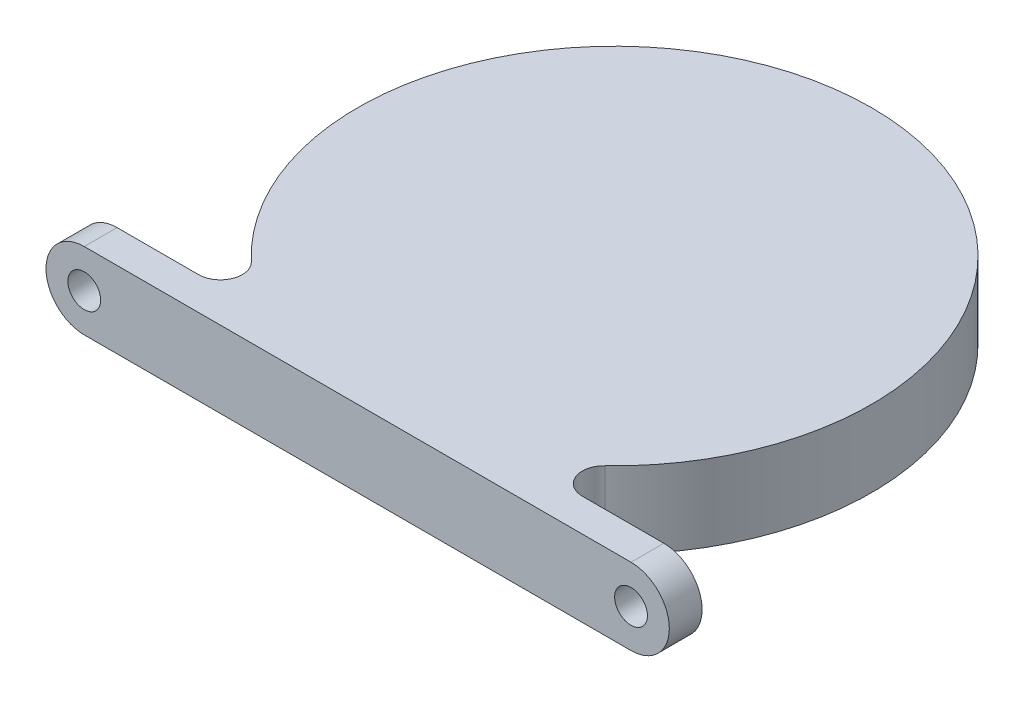
ISO-10303-21;
HEADER;
FILE_DESCRIPTION(('STEP AP214'),'2;1');
FILE_NAME('part.step','',(''),(''),'','','');
FILE_SCHEMA(('AUTOMOTIVE_DESIGN { 1 0 10303 214 1 1 1 1 }'));
ENDSEC;
DATA;
#1=APPLICATION_CONTEXT('core data for automotive mechanical design processes');
#2=APPLICATION_PROTOCOL_DEFINITION('international standard','automotive_design',2000,#1);
#3=PRODUCT_CONTEXT('',#1,'mechanical');
#4=PRODUCT('Part','Part','',(#3));
#5=PRODUCT_RELATED_PRODUCT_CATEGORY('part','',(#4));
#6=PRODUCT_DEFINITION_FORMATION('','',#4);
#7=PRODUCT_DEFINITION_CONTEXT('part definition',#1,'design');
#8=PRODUCT_DEFINITION('design','',#6,#7);
#9=PRODUCT_DEFINITION_SHAPE('','',#8);
#10=(LENGTH_UNIT() NAMED_UNIT(*) SI_UNIT(.MILLI.,.METRE.));
#11=(NAMED_UNIT(*) PLANE_ANGLE_UNIT() SI_UNIT($,.RADIAN.));
#12=(NAMED_UNIT(*) SI_UNIT($,.STERADIAN.) SOLID_ANGLE_UNIT());
#13=UNCERTAINTY_MEASURE_WITH_UNIT(LENGTH_MEASURE(1.E-05),#10,'distance_accuracy_value','');
#14=(GEOMETRIC_REPRESENTATION_CONTEXT(3) GLOBAL_UNCERTAINTY_ASSIGNED_CONTEXT((#13)) GLOBAL_UNIT_ASSIGNED_CONTEXT((#10,
#11,#12)) REPRESENTATION_CONTEXT('',''));
#15=CARTESIAN_POINT('',(0.,0.,0.));
#16=DIRECTION('',(0.,0.,1.));
#17=DIRECTION('',(1.,0.,0.));
#18=AXIS2_PLACEMENT_3D('',#15,#16,#17);
#19=CARTESIAN_POINT('',(0.,7.,0.));
#20=DIRECTION('',(0.,-1.,0.));
#21=DIRECTION('',(0.,0.,-1.));
#22=AXIS2_PLACEMENT_3D('',#19,#20,#21);
#23=CYLINDRICAL_SURFACE('',#22,23.5);
#24=CARTESIAN_POINT('',(0.,7.,0.));
#25=DIRECTION('',(0.,1.,0.));
#26=DIRECTION('',(0.,0.,1.));
#27=AXIS2_PLACEMENT_3D('',#24,#25,#26);
#28=CIRCLE('',#27,23.5);
#29=CARTESIAN_POINT('',(16.1734637728404,7.,17.0490196078431));
#30=VERTEX_POINT('',#29);
#31=CARTESIAN_POINT('',(-16.1734637728404,7.,17.0490196078431));
#32=VERTEX_POINT('',#31);
#33=EDGE_CURVE('E170',#30,#32,#28,.T.);
#34=ORIENTED_EDGE('',*,*,#33,.F.);
#35=DIRECTION('',(0.,-1.,0.));
#36=VECTOR('',#35,1.);
#37=CARTESIAN_POINT('',(16.1734637728404,7.,17.0490196078431));
#38=LINE('',#37,#36);
#39=CARTESIAN_POINT('',(16.1734637728404,0.,17.0490196078431));
#40=VERTEX_POINT('',#39);
#41=EDGE_CURVE('E181',#30,#40,#38,.T.);
#42=ORIENTED_EDGE('',*,*,#41,.T.);
#43=CARTESIAN_POINT('',(0.,0.,0.));
#44=DIRECTION('',(0.,1.,0.));
#45=DIRECTION('',(0.,0.,1.));
#46=AXIS2_PLACEMENT_3D('',#43,#44,#45);
#47=CIRCLE('',#46,23.5);
#48=CARTESIAN_POINT('',(-16.1734637728404,0.,17.0490196078431));
#49=VERTEX_POINT('',#48);
#50=EDGE_CURVE('E164',#40,#49,#47,.T.);
#51=ORIENTED_EDGE('',*,*,#50,.T.);
#52=DIRECTION('',(0.,-1.,0.));
#53=VECTOR('',#52,1.);
#54=CARTESIAN_POINT('',(-16.1734637728404,7.,17.0490196078431));
#55=LINE('',#54,#53);
#56=EDGE_CURVE('E178',#49,#32,#55,.F.);
#57=ORIENTED_EDGE('',*,*,#56,.T.);
#58=EDGE_LOOP('',(#34,#42,#51,#57));
#59=FACE_BOUND('',#58,.T.);
#60=ADVANCED_FACE('F41',(#59),#23,.T.);
#61=CARTESIAN_POINT('',(0.,7.,0.));
#62=DIRECTION('',(0.,1.,0.));
#63=DIRECTION('',(0.,0.,1.));
#64=AXIS2_PLACEMENT_3D('',#61,#62,#63);
#65=PLANE('',#64);
#66=DIRECTION('',(-1.,0.,0.));
#67=VECTOR('',#66,1.);
#68=CARTESIAN_POINT('',(-25.,7.,20.5));
#69=LINE('',#68,#67);
#70=CARTESIAN_POINT('',(25.,7.00000000000001,20.5));
#71=VERTEX_POINT('',#70);
#72=CARTESIAN_POINT('',(17.5499287747842,7.,20.5));
#73=VERTEX_POINT('',#72);
#74=EDGE_CURVE('E108',#71,#73,#69,.T.);
#75=ORIENTED_EDGE('',*,*,#74,.T.);
#76=CARTESIAN_POINT('',(17.5499287747842,7.,18.5));
#77=DIRECTION('',(0.,1.,0.));
#78=DIRECTION('',(0.,0.,1.));
#79=AXIS2_PLACEMENT_3D('',#76,#77,#78);
#80=CIRCLE('',#79,2.);
#81=EDGE_CURVE('E187',#73,#30,#80,.F.);
#82=ORIENTED_EDGE('',*,*,#81,.T.);
#83=ORIENTED_EDGE('',*,*,#33,.T.);
#84=CARTESIAN_POINT('',(-17.5499287747842,7.,18.5));
#85=DIRECTION('',(0.,1.,0.));
#86=DIRECTION('',(0.,0.,1.));
#87=AXIS2_PLACEMENT_3D('',#84,#85,#86);
#88=CIRCLE('',#87,2.);
#89=CARTESIAN_POINT('',(-17.5499287747842,7.,20.5));
#90=VERTEX_POINT('',#89);
#91=EDGE_CURVE('E11',#32,#90,#88,.F.);
#92=ORIENTED_EDGE('',*,*,#91,.T.);
#93=CARTESIAN_POINT('',(-25.,7.,20.5));
#94=VERTEX_POINT('',#93);
#95=EDGE_CURVE('E129',#90,#94,#69,.T.);
#96=ORIENTED_EDGE('',*,*,#95,.T.);
#97=DIRECTION('',(0.,0.,1.));
#98=VECTOR('',#97,1.);
#99=CARTESIAN_POINT('',(-25.,7.,20.5));
#100=LINE('',#99,#98);
#101=CARTESIAN_POINT('',(-25.,7.,23.5));
#102=VERTEX_POINT('',#101);
#103=EDGE_CURVE('E116',#94,#102,#100,.T.);
#104=ORIENTED_EDGE('',*,*,#103,.T.);
#105=DIRECTION('',(-1.,0.,0.));
#106=VECTOR('',#105,1.);
#107=CARTESIAN_POINT('',(-25.,7.,23.5));
#108=LINE('',#107,#106);
#109=CARTESIAN_POINT('',(25.,7.00000000000001,23.5));
#110=VERTEX_POINT('',#109);
#111=EDGE_CURVE('E110',#110,#102,#108,.T.);
#112=ORIENTED_EDGE('',*,*,#111,.F.);
#113=DIRECTION('',(0.,0.,1.));
#114=VECTOR('',#113,1.);
#115=CARTESIAN_POINT('',(25.,7.00000000000001,20.5));
#116=LINE('',#115,#114);
#117=EDGE_CURVE('E105',#71,#110,#116,.T.);
#118=ORIENTED_EDGE('',*,*,#117,.F.);
#119=EDGE_LOOP('',(#75,#82,#83,#92,#96,#104,#112,#118));
#120=FACE_BOUND('',#119,.T.);
#121=ADVANCED_FACE('F107',(#120),#65,.T.);
#122=CARTESIAN_POINT('',(0.,0.,0.));
#123=DIRECTION('',(0.,1.,0.));
#124=DIRECTION('',(0.,0.,1.));
#125=AXIS2_PLACEMENT_3D('',#122,#123,#124);
#126=PLANE('',#125);
#127=ORIENTED_EDGE('',*,*,#50,.F.);
#128=CARTESIAN_POINT('',(17.5499287747842,0.,18.5));
#129=DIRECTION('',(0.,1.,0.));
#130=DIRECTION('',(0.,0.,1.));
#131=AXIS2_PLACEMENT_3D('',#128,#129,#130);
#132=CIRCLE('',#131,2.);
#133=CARTESIAN_POINT('',(17.5499287747842,0.,20.5));
#134=VERTEX_POINT('',#133);
#135=EDGE_CURVE('E190',#40,#134,#132,.T.);
#136=ORIENTED_EDGE('',*,*,#135,.T.);
#137=DIRECTION('',(1.,0.,0.));
#138=VECTOR('',#137,1.);
#139=CARTESIAN_POINT('',(-25.,0.,20.5));
#140=LINE('',#139,#138);
#141=CARTESIAN_POINT('',(25.,0.,20.5));
#142=VERTEX_POINT('',#141);
#143=EDGE_CURVE('E149',#134,#142,#140,.T.);
#144=ORIENTED_EDGE('',*,*,#143,.T.);
#145=DIRECTION('',(0.,0.,1.));
#146=VECTOR('',#145,1.);
#147=CARTESIAN_POINT('',(25.,0.,20.5));
#148=LINE('',#147,#146);
#149=CARTESIAN_POINT('',(25.,0.,23.5));
#150=VERTEX_POINT('',#149);
#151=EDGE_CURVE('E134',#142,#150,#148,.T.);
#152=ORIENTED_EDGE('',*,*,#151,.T.);
#153=DIRECTION('',(1.,0.,0.));
#154=VECTOR('',#153,1.);
#155=CARTESIAN_POINT('',(-25.,0.,23.5));
#156=LINE('',#155,#154);
#157=CARTESIAN_POINT('',(-25.,0.,23.5));
#158=VERTEX_POINT('',#157);
#159=EDGE_CURVE('E136',#158,#150,#156,.T.);
#160=ORIENTED_EDGE('',*,*,#159,.F.);
#161=DIRECTION('',(0.,0.,1.));
#162=VECTOR('',#161,1.);
#163=CARTESIAN_POINT('',(-25.,0.,20.5));
#164=LINE('',#163,#162);
#165=CARTESIAN_POINT('',(-25.,0.,20.5));
#166=VERTEX_POINT('',#165);
#167=EDGE_CURVE('E165',#166,#158,#164,.T.);
#168=ORIENTED_EDGE('',*,*,#167,.F.);
#169=CARTESIAN_POINT('',(-17.5499287747842,0.,20.5));
#170=VERTEX_POINT('',#169);
#171=EDGE_CURVE('E117',#166,#170,#140,.T.);
#172=ORIENTED_EDGE('',*,*,#171,.T.);
#173=CARTESIAN_POINT('',(-17.5499287747842,0.,18.5));
#174=DIRECTION('',(0.,1.,0.));
#175=DIRECTION('',(0.,0.,1.));
#176=AXIS2_PLACEMENT_3D('',#173,#174,#175);
#177=CIRCLE('',#176,2.);
#178=EDGE_CURVE('E50',#170,#49,#177,.T.);
#179=ORIENTED_EDGE('',*,*,#178,.T.);
#180=EDGE_LOOP('',(#127,#136,#144,#152,#160,#168,#172,#179));
#181=FACE_BOUND('',#180,.T.);
#182=ADVANCED_FACE('F195',(#181),#126,.F.);
#183=CARTESIAN_POINT('',(25.,3.50000000000001,20.5));
#184=DIRECTION('',(0.,0.,1.));
#185=DIRECTION('',(1.,0.,0.));
#186=AXIS2_PLACEMENT_3D('',#183,#184,#185);
#187=PLANE('',#186);
#188=CARTESIAN_POINT('',(-25.,3.5,20.5));
#189=DIRECTION('',(0.,0.,1.));
#190=DIRECTION('',(1.,0.,0.));
#191=AXIS2_PLACEMENT_3D('',#188,#189,#190);
#192=CIRCLE('',#191,1.5);
#193=CARTESIAN_POINT('',(-23.5,3.5,20.5));
#194=VERTEX_POINT('',#193);
#195=EDGE_CURVE('E156',#194,#194,#192,.T.);
#196=ORIENTED_EDGE('',*,*,#195,.T.);
#197=EDGE_LOOP('',(#196));
#198=FACE_BOUND('',#197,.T.);
#199=ORIENTED_EDGE('',*,*,#95,.F.);
#200=DIRECTION('',(0.,1.,0.));
#201=VECTOR('',#200,1.);
#202=CARTESIAN_POINT('',(-17.5499287747842,0.,20.5));
#203=LINE('',#202,#201);
#204=EDGE_CURVE('E184',#90,#170,#203,.F.);
#205=ORIENTED_EDGE('',*,*,#204,.T.);
#206=ORIENTED_EDGE('',*,*,#171,.F.);
#207=CARTESIAN_POINT('',(-25.,3.5,20.5));
#208=DIRECTION('',(0.,0.,1.));
#209=DIRECTION('',(1.,0.,0.));
#210=AXIS2_PLACEMENT_3D('',#207,#208,#209);
#211=CIRCLE('',#210,3.5);
#212=EDGE_CURVE('E128',#94,#166,#211,.T.);
#213=ORIENTED_EDGE('',*,*,#212,.F.);
#214=EDGE_LOOP('',(#199,#205,#206,#213));
#215=FACE_BOUND('',#214,.T.);
#216=ADVANCED_FACE('F202',(#198,#215),#187,.F.);
#217=CARTESIAN_POINT('',(25.,3.50000000000001,20.5));
#218=DIRECTION('',(0.,0.,1.));
#219=DIRECTION('',(1.,0.,0.));
#220=AXIS2_PLACEMENT_3D('',#217,#218,#219);
#221=CIRCLE('',#220,1.5);
#222=CARTESIAN_POINT('',(26.5,3.50000000000001,20.5));
#223=VERTEX_POINT('',#222);
#224=EDGE_CURVE('E253',#223,#223,#221,.T.);
#225=ORIENTED_EDGE('',*,*,#224,.T.);
#226=EDGE_LOOP('',(#225));
#227=FACE_BOUND('',#226,.T.);
#228=ORIENTED_EDGE('',*,*,#143,.F.);
#229=DIRECTION('',(0.,1.,0.));
#230=VECTOR('',#229,1.);
#231=CARTESIAN_POINT('',(17.5499287747842,7.,20.5));
#232=LINE('',#231,#230);
#233=EDGE_CURVE('E126',#134,#73,#232,.T.);
#234=ORIENTED_EDGE('',*,*,#233,.T.);
#235=ORIENTED_EDGE('',*,*,#74,.F.);
#236=CARTESIAN_POINT('',(25.,3.50000000000001,20.5));
#237=DIRECTION('',(0.,0.,1.));
#238=DIRECTION('',(1.,0.,0.));
#239=AXIS2_PLACEMENT_3D('',#236,#237,#238);
#240=CIRCLE('',#239,3.5);
#241=EDGE_CURVE('E124',#142,#71,#240,.T.);
#242=ORIENTED_EDGE('',*,*,#241,.F.);
#243=EDGE_LOOP('',(#228,#234,#235,#242));
#244=FACE_BOUND('',#243,.T.);
#245=ADVANCED_FACE('F123',(#227,#244),#187,.F.);
#246=CARTESIAN_POINT('',(25.,3.50000000000001,23.5));
#247=DIRECTION('',(0.,0.,1.));
#248=DIRECTION('',(1.,0.,0.));
#249=AXIS2_PLACEMENT_3D('',#246,#247,#248);
#250=PLANE('',#249);
#251=CARTESIAN_POINT('',(-25.,3.5,23.5));
#252=DIRECTION('',(0.,0.,1.));
#253=DIRECTION('',(1.,0.,0.));
#254=AXIS2_PLACEMENT_3D('',#251,#252,#253);
#255=CIRCLE('',#254,1.5);
#256=CARTESIAN_POINT('',(-23.5,3.5,23.5));
#257=VERTEX_POINT('',#256);
#258=EDGE_CURVE('E143',#257,#257,#255,.T.);
#259=ORIENTED_EDGE('',*,*,#258,.F.);
#260=EDGE_LOOP('',(#259));
#261=FACE_BOUND('',#260,.T.);
#262=ORIENTED_EDGE('',*,*,#159,.T.);
#263=CARTESIAN_POINT('',(25.,3.50000000000001,23.5));
#264=DIRECTION('',(0.,0.,1.));
#265=DIRECTION('',(1.,0.,0.));
#266=AXIS2_PLACEMENT_3D('',#263,#264,#265);
#267=CIRCLE('',#266,3.5);
#268=EDGE_CURVE('E153',#150,#110,#267,.T.);
#269=ORIENTED_EDGE('',*,*,#268,.T.);
#270=ORIENTED_EDGE('',*,*,#111,.T.);
#271=CARTESIAN_POINT('',(-25.,3.5,23.5));
#272=DIRECTION('',(0.,0.,1.));
#273=DIRECTION('',(1.,0.,0.));
#274=AXIS2_PLACEMENT_3D('',#271,#272,#273);
#275=CIRCLE('',#274,3.5);
#276=EDGE_CURVE('E140',#102,#158,#275,.T.);
#277=ORIENTED_EDGE('',*,*,#276,.T.);
#278=EDGE_LOOP('',(#262,#269,#270,#277));
#279=FACE_BOUND('',#278,.T.);
#280=CARTESIAN_POINT('',(25.,3.50000000000001,23.5));
#281=DIRECTION('',(0.,0.,1.));
#282=DIRECTION('',(1.,0.,0.));
#283=AXIS2_PLACEMENT_3D('',#280,#281,#282);
#284=CIRCLE('',#283,1.5);
#285=CARTESIAN_POINT('',(26.5,3.50000000000001,23.5));
#286=VERTEX_POINT('',#285);
#287=EDGE_CURVE('E257',#286,#286,#284,.T.);
#288=ORIENTED_EDGE('',*,*,#287,.F.);
#289=EDGE_LOOP('',(#288));
#290=FACE_BOUND('',#289,.T.);
#291=ADVANCED_FACE('F210',(#261,#279,#290),#250,.T.);
#292=CARTESIAN_POINT('',(25.,3.50000000000001,20.5));
#293=DIRECTION('',(0.,0.,1.));
#294=DIRECTION('',(1.,0.,0.));
#295=AXIS2_PLACEMENT_3D('',#292,#293,#294);
#296=CYLINDRICAL_SURFACE('',#295,3.5);
#297=ORIENTED_EDGE('',*,*,#268,.F.);
#298=ORIENTED_EDGE('',*,*,#151,.F.);
#299=ORIENTED_EDGE('',*,*,#241,.T.);
#300=ORIENTED_EDGE('',*,*,#117,.T.);
#301=EDGE_LOOP('',(#297,#298,#299,#300));
#302=FACE_BOUND('',#301,.T.);
#303=ADVANCED_FACE('F132',(#302),#296,.T.);
#304=CARTESIAN_POINT('',(-25.,3.5,20.5));
#305=DIRECTION('',(0.,0.,1.));
#306=DIRECTION('',(1.,0.,0.));
#307=AXIS2_PLACEMENT_3D('',#304,#305,#306);
#308=CYLINDRICAL_SURFACE('',#307,3.5);
#309=ORIENTED_EDGE('',*,*,#276,.F.);
#310=ORIENTED_EDGE('',*,*,#103,.F.);
#311=ORIENTED_EDGE('',*,*,#212,.T.);
#312=ORIENTED_EDGE('',*,*,#167,.T.);
#313=EDGE_LOOP('',(#309,#310,#311,#312));
#314=FACE_BOUND('',#313,.T.);
#315=ADVANCED_FACE('F207',(#314),#308,.T.);
#316=CARTESIAN_POINT('',(-25.,3.5,20.5));
#317=DIRECTION('',(0.,0.,1.));
#318=DIRECTION('',(1.,0.,0.));
#319=AXIS2_PLACEMENT_3D('',#316,#317,#318);
#320=CYLINDRICAL_SURFACE('',#319,1.5);
#321=ORIENTED_EDGE('',*,*,#195,.F.);
#322=EDGE_LOOP('',(#321));
#323=FACE_BOUND('',#322,.T.);
#324=ORIENTED_EDGE('',*,*,#258,.T.);
#325=EDGE_LOOP('',(#324));
#326=FACE_BOUND('',#325,.T.);
#327=ADVANCED_FACE('F221',(#323,#326),#320,.F.);
#328=CARTESIAN_POINT('',(25.,3.50000000000001,20.5));
#329=DIRECTION('',(0.,0.,1.));
#330=DIRECTION('',(1.,0.,0.));
#331=AXIS2_PLACEMENT_3D('',#328,#329,#330);
#332=CYLINDRICAL_SURFACE('',#331,1.5);
#333=ORIENTED_EDGE('',*,*,#224,.F.);
#334=EDGE_LOOP('',(#333));
#335=FACE_BOUND('',#334,.T.);
#336=ORIENTED_EDGE('',*,*,#287,.T.);
#337=EDGE_LOOP('',(#336));
#338=FACE_BOUND('',#337,.T.);
#339=ADVANCED_FACE('F216',(#335,#338),#332,.F.);
#340=CARTESIAN_POINT('',(17.5499287747842,7.,18.5));
#341=DIRECTION('',(0.,-1.,0.));
#342=DIRECTION('',(0.,0.,-1.));
#343=AXIS2_PLACEMENT_3D('',#340,#341,#342);
#344=CYLINDRICAL_SURFACE('',#343,2.);
#345=ORIENTED_EDGE('',*,*,#135,.F.);
#346=ORIENTED_EDGE('',*,*,#41,.F.);
#347=ORIENTED_EDGE('',*,*,#81,.F.);
#348=ORIENTED_EDGE('',*,*,#233,.F.);
#349=EDGE_LOOP('',(#345,#346,#347,#348));
#350=FACE_BOUND('',#349,.T.);
#351=ADVANCED_FACE('F214',(#350),#344,.F.);
#352=CARTESIAN_POINT('',(-17.5499287747842,7.,18.5));
#353=DIRECTION('',(0.,-1.,0.));
#354=DIRECTION('',(0.,0.,-1.));
#355=AXIS2_PLACEMENT_3D('',#352,#353,#354);
#356=CYLINDRICAL_SURFACE('',#355,2.);
#357=ORIENTED_EDGE('',*,*,#91,.F.);
#358=ORIENTED_EDGE('',*,*,#56,.F.);
#359=ORIENTED_EDGE('',*,*,#178,.F.);
#360=ORIENTED_EDGE('',*,*,#204,.F.);
#361=EDGE_LOOP('',(#357,#358,#359,#360));
#362=FACE_BOUND('',#361,.T.);
#363=ADVANCED_FACE('F43',(#362),#356,.F.);
#364=CLOSED_SHELL('',(#60,#121,#182,#216,#245,#291,#303,#315,#327,#339,#351,#363));
#365=MANIFOLD_SOLID_BREP('B2',#364);
#366=ADVANCED_BREP_SHAPE_REPRESENTATION('',(#18,#365),#14);
#367=SHAPE_DEFINITION_REPRESENTATION(#9,#366);
ENDSEC;
END-ISO-10303-21;
